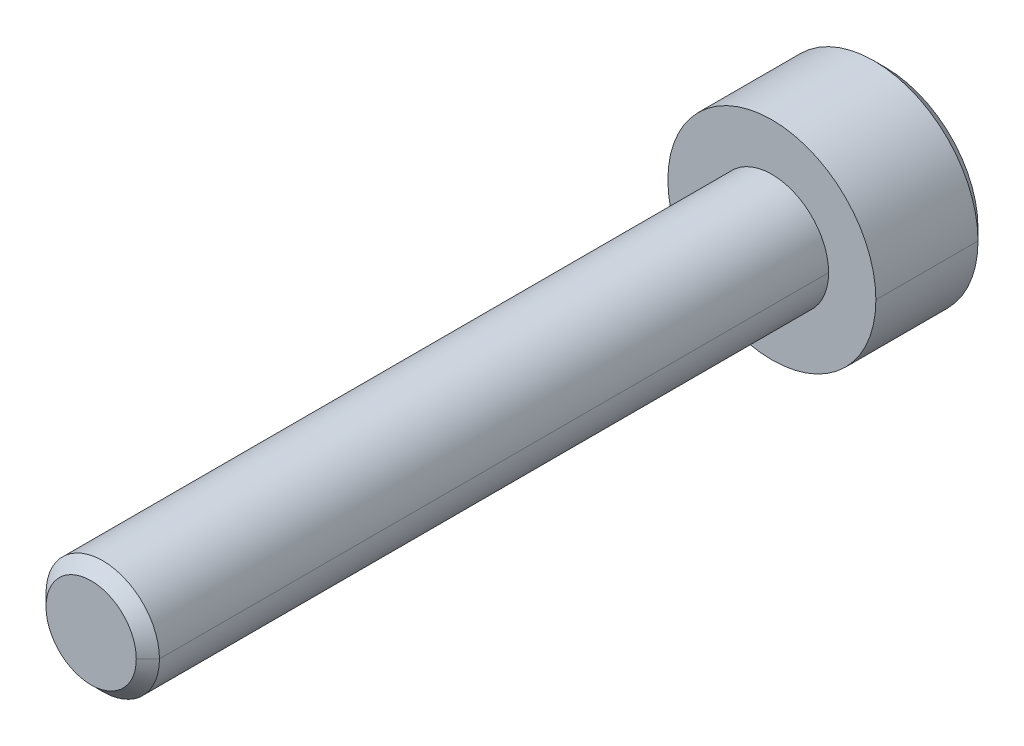
ISO-10303-21;
HEADER;
FILE_DESCRIPTION(('STEP AP214'),'2;1');
FILE_NAME('part.step','',(''),(''),'','','');
FILE_SCHEMA(('AUTOMOTIVE_DESIGN { 1 0 10303 214 1 1 1 1 }'));
ENDSEC;
DATA;
#1=APPLICATION_CONTEXT('core data for automotive mechanical design processes');
#2=APPLICATION_PROTOCOL_DEFINITION('international standard','automotive_design',2000,#1);
#3=PRODUCT_CONTEXT('',#1,'mechanical');
#4=PRODUCT('Part','Part','',(#3));
#5=PRODUCT_RELATED_PRODUCT_CATEGORY('part','',(#4));
#6=PRODUCT_DEFINITION_FORMATION('','',#4);
#7=PRODUCT_DEFINITION_CONTEXT('part definition',#1,'design');
#8=PRODUCT_DEFINITION('design','',#6,#7);
#9=PRODUCT_DEFINITION_SHAPE('','',#8);
#10=(LENGTH_UNIT() NAMED_UNIT(*) SI_UNIT(.MILLI.,.METRE.));
#11=(NAMED_UNIT(*) PLANE_ANGLE_UNIT() SI_UNIT($,.RADIAN.));
#12=(NAMED_UNIT(*) SI_UNIT($,.STERADIAN.) SOLID_ANGLE_UNIT());
#13=UNCERTAINTY_MEASURE_WITH_UNIT(LENGTH_MEASURE(1.E-05),#10,'distance_accuracy_value','');
#14=(GEOMETRIC_REPRESENTATION_CONTEXT(3) GLOBAL_UNCERTAINTY_ASSIGNED_CONTEXT((#13)) GLOBAL_UNIT_ASSIGNED_CONTEXT((#10,
#11,#12)) REPRESENTATION_CONTEXT('',''));
#15=CARTESIAN_POINT('',(0.,0.,0.));
#16=DIRECTION('',(0.,0.,1.));
#17=DIRECTION('',(1.,0.,0.));
#18=AXIS2_PLACEMENT_3D('',#15,#16,#17);
#19=CARTESIAN_POINT('',(0.,0.,1.3));
#20=DIRECTION('',(0.,0.,-1.));
#21=DIRECTION('',(0.,-1.,0.));
#22=AXIS2_PLACEMENT_3D('',#19,#20,#21);
#23=PLANE('',#22);
#24=DIRECTION('',(0.866025403784439,0.5,0.));
#25=VECTOR('',#24,1.);
#26=CARTESIAN_POINT('',(-1.25,0.721687836487033,1.3));
#27=LINE('',#26,#25);
#28=CARTESIAN_POINT('',(-1.25,0.721687836487033,1.3));
#29=VERTEX_POINT('',#28);
#30=CARTESIAN_POINT('',(0.,1.44337567297406,1.3));
#31=VERTEX_POINT('',#30);
#32=EDGE_CURVE('E143',#29,#31,#27,.T.);
#33=ORIENTED_EDGE('',*,*,#32,.T.);
#34=DIRECTION('',(0.866025403784439,-0.5,0.));
#35=VECTOR('',#34,1.);
#36=CARTESIAN_POINT('',(0.,1.44337567297406,1.3));
#37=LINE('',#36,#35);
#38=CARTESIAN_POINT('',(1.25,0.721687836487033,1.3));
#39=VERTEX_POINT('',#38);
#40=EDGE_CURVE('E9',#31,#39,#37,.T.);
#41=ORIENTED_EDGE('',*,*,#40,.T.);
#42=DIRECTION('',(0.,-1.,0.));
#43=VECTOR('',#42,1.);
#44=CARTESIAN_POINT('',(1.25,0.721687836487033,1.3));
#45=LINE('',#44,#43);
#46=CARTESIAN_POINT('',(1.25,-0.721687836487033,1.3));
#47=VERTEX_POINT('',#46);
#48=EDGE_CURVE('E43',#39,#47,#45,.T.);
#49=ORIENTED_EDGE('',*,*,#48,.T.);
#50=DIRECTION('',(-0.866025403784439,-0.5,0.));
#51=VECTOR('',#50,1.);
#52=CARTESIAN_POINT('',(1.25,-0.721687836487033,1.3));
#53=LINE('',#52,#51);
#54=CARTESIAN_POINT('',(0.,-1.44337567297406,1.3));
#55=VERTEX_POINT('',#54);
#56=EDGE_CURVE('E173',#47,#55,#53,.T.);
#57=ORIENTED_EDGE('',*,*,#56,.T.);
#58=DIRECTION('',(-0.866025403784439,0.5,0.));
#59=VECTOR('',#58,1.);
#60=CARTESIAN_POINT('',(0.,-1.44337567297406,1.3));
#61=LINE('',#60,#59);
#62=CARTESIAN_POINT('',(-1.25,-0.721687836487033,1.3));
#63=VERTEX_POINT('',#62);
#64=EDGE_CURVE('E202',#55,#63,#61,.T.);
#65=ORIENTED_EDGE('',*,*,#64,.T.);
#66=DIRECTION('',(0.,1.,0.));
#67=VECTOR('',#66,1.);
#68=CARTESIAN_POINT('',(-1.25,-0.721687836487033,1.3));
#69=LINE('',#68,#67);
#70=EDGE_CURVE('E196',#63,#29,#69,.T.);
#71=ORIENTED_EDGE('',*,*,#70,.T.);
#72=EDGE_LOOP('',(#33,#41,#49,#57,#65,#71));
#73=FACE_BOUND('',#72,.T.);
#74=ADVANCED_FACE('F15',(#73),#23,.T.);
#75=CARTESIAN_POINT('',(0.,1.44337567297406,1.3));
#76=DIRECTION('',(0.5,0.866025403784439,0.));
#77=DIRECTION('',(0.,0.,-1.));
#78=AXIS2_PLACEMENT_3D('',#75,#76,#77);
#79=PLANE('',#78);
#80=DIRECTION('',(0.866025403784439,-0.5,0.));
#81=VECTOR('',#80,1.);
#82=CARTESIAN_POINT('',(0.,1.44337567297406,0.));
#83=LINE('',#82,#81);
#84=CARTESIAN_POINT('',(0.,1.44337567297406,0.));
#85=VERTEX_POINT('',#84);
#86=CARTESIAN_POINT('',(1.25,0.721687836487033,0.));
#87=VERTEX_POINT('',#86);
#88=EDGE_CURVE('E139',#85,#87,#83,.T.);
#89=ORIENTED_EDGE('',*,*,#88,.T.);
#90=DIRECTION('',(0.,0.,-1.));
#91=VECTOR('',#90,1.);
#92=CARTESIAN_POINT('',(1.25,0.721687836487033,1.3));
#93=LINE('',#92,#91);
#94=EDGE_CURVE('E18',#39,#87,#93,.T.);
#95=ORIENTED_EDGE('',*,*,#94,.F.);
#96=ORIENTED_EDGE('',*,*,#40,.F.);
#97=DIRECTION('',(0.,0.,-1.));
#98=VECTOR('',#97,1.);
#99=CARTESIAN_POINT('',(0.,1.44337567297406,1.3));
#100=LINE('',#99,#98);
#101=EDGE_CURVE('E135',#31,#85,#100,.T.);
#102=ORIENTED_EDGE('',*,*,#101,.T.);
#103=EDGE_LOOP('',(#89,#95,#96,#102));
#104=FACE_BOUND('',#103,.T.);
#105=ADVANCED_FACE('F137',(#104),#79,.F.);
#106=CARTESIAN_POINT('',(1.25,0.721687836487033,1.3));
#107=DIRECTION('',(1.,0.,0.));
#108=DIRECTION('',(0.,1.,0.));
#109=AXIS2_PLACEMENT_3D('',#106,#107,#108);
#110=PLANE('',#109);
#111=DIRECTION('',(0.,-1.,0.));
#112=VECTOR('',#111,1.);
#113=CARTESIAN_POINT('',(1.25,0.721687836487033,0.));
#114=LINE('',#113,#112);
#115=CARTESIAN_POINT('',(1.25,-0.721687836487033,0.));
#116=VERTEX_POINT('',#115);
#117=EDGE_CURVE('E162',#87,#116,#114,.T.);
#118=ORIENTED_EDGE('',*,*,#117,.T.);
#119=DIRECTION('',(0.,0.,-1.));
#120=VECTOR('',#119,1.);
#121=CARTESIAN_POINT('',(1.25,-0.721687836487033,1.3));
#122=LINE('',#121,#120);
#123=EDGE_CURVE('E208',#47,#116,#122,.T.);
#124=ORIENTED_EDGE('',*,*,#123,.F.);
#125=ORIENTED_EDGE('',*,*,#48,.F.);
#126=ORIENTED_EDGE('',*,*,#94,.T.);
#127=EDGE_LOOP('',(#118,#124,#125,#126));
#128=FACE_BOUND('',#127,.T.);
#129=ADVANCED_FACE('F217',(#128),#110,.F.);
#130=CARTESIAN_POINT('',(1.25,-0.721687836487033,1.3));
#131=DIRECTION('',(0.5,-0.866025403784439,0.));
#132=DIRECTION('',(0.,0.,-1.));
#133=AXIS2_PLACEMENT_3D('',#130,#131,#132);
#134=PLANE('',#133);
#135=DIRECTION('',(-0.866025403784439,-0.5,0.));
#136=VECTOR('',#135,1.);
#137=CARTESIAN_POINT('',(1.25,-0.721687836487033,0.));
#138=LINE('',#137,#136);
#139=CARTESIAN_POINT('',(0.,-1.44337567297406,0.));
#140=VERTEX_POINT('',#139);
#141=EDGE_CURVE('E181',#116,#140,#138,.T.);
#142=ORIENTED_EDGE('',*,*,#141,.T.);
#143=DIRECTION('',(0.,0.,-1.));
#144=VECTOR('',#143,1.);
#145=CARTESIAN_POINT('',(0.,-1.44337567297406,1.3));
#146=LINE('',#145,#144);
#147=EDGE_CURVE('E205',#55,#140,#146,.T.);
#148=ORIENTED_EDGE('',*,*,#147,.F.);
#149=ORIENTED_EDGE('',*,*,#56,.F.);
#150=ORIENTED_EDGE('',*,*,#123,.T.);
#151=EDGE_LOOP('',(#142,#148,#149,#150));
#152=FACE_BOUND('',#151,.T.);
#153=ADVANCED_FACE('F221',(#152),#134,.F.);
#154=CARTESIAN_POINT('',(0.,-1.44337567297406,1.3));
#155=DIRECTION('',(-0.5,-0.866025403784439,0.));
#156=DIRECTION('',(-0.866025403784439,0.5,0.));
#157=AXIS2_PLACEMENT_3D('',#154,#155,#156);
#158=PLANE('',#157);
#159=DIRECTION('',(-0.866025403784439,0.5,0.));
#160=VECTOR('',#159,1.);
#161=CARTESIAN_POINT('',(0.,-1.44337567297406,0.));
#162=LINE('',#161,#160);
#163=CARTESIAN_POINT('',(-1.25,-0.721687836487033,0.));
#164=VERTEX_POINT('',#163);
#165=EDGE_CURVE('E177',#140,#164,#162,.T.);
#166=ORIENTED_EDGE('',*,*,#165,.T.);
#167=DIRECTION('',(0.,0.,-1.));
#168=VECTOR('',#167,1.);
#169=CARTESIAN_POINT('',(-1.25,-0.721687836487033,1.3));
#170=LINE('',#169,#168);
#171=EDGE_CURVE('E199',#63,#164,#170,.T.);
#172=ORIENTED_EDGE('',*,*,#171,.F.);
#173=ORIENTED_EDGE('',*,*,#64,.F.);
#174=ORIENTED_EDGE('',*,*,#147,.T.);
#175=EDGE_LOOP('',(#166,#172,#173,#174));
#176=FACE_BOUND('',#175,.T.);
#177=ADVANCED_FACE('F496',(#176),#158,.F.);
#178=CARTESIAN_POINT('',(-1.25,-0.721687836487033,1.3));
#179=DIRECTION('',(-1.,0.,0.));
#180=DIRECTION('',(0.,0.,1.));
#181=AXIS2_PLACEMENT_3D('',#178,#179,#180);
#182=PLANE('',#181);
#183=DIRECTION('',(0.,1.,0.));
#184=VECTOR('',#183,1.);
#185=CARTESIAN_POINT('',(-1.25,-0.721687836487033,0.));
#186=LINE('',#185,#184);
#187=CARTESIAN_POINT('',(-1.25,0.721687836487033,0.));
#188=VERTEX_POINT('',#187);
#189=EDGE_CURVE('E155',#164,#188,#186,.T.);
#190=ORIENTED_EDGE('',*,*,#189,.T.);
#191=DIRECTION('',(0.,0.,-1.));
#192=VECTOR('',#191,1.);
#193=CARTESIAN_POINT('',(-1.25,0.721687836487033,1.3));
#194=LINE('',#193,#192);
#195=EDGE_CURVE('E150',#29,#188,#194,.T.);
#196=ORIENTED_EDGE('',*,*,#195,.F.);
#197=ORIENTED_EDGE('',*,*,#70,.F.);
#198=ORIENTED_EDGE('',*,*,#171,.T.);
#199=EDGE_LOOP('',(#190,#196,#197,#198));
#200=FACE_BOUND('',#199,.T.);
#201=ADVANCED_FACE('F493',(#200),#182,.F.);
#202=CARTESIAN_POINT('',(-1.25,0.721687836487033,1.3));
#203=DIRECTION('',(-0.5,0.866025403784439,0.));
#204=DIRECTION('',(0.,0.,1.));
#205=AXIS2_PLACEMENT_3D('',#202,#203,#204);
#206=PLANE('',#205);
#207=DIRECTION('',(0.866025403784439,0.5,0.));
#208=VECTOR('',#207,1.);
#209=CARTESIAN_POINT('',(-1.25,0.721687836487033,0.));
#210=LINE('',#209,#208);
#211=EDGE_CURVE('E147',#188,#85,#210,.T.);
#212=ORIENTED_EDGE('',*,*,#211,.T.);
#213=ORIENTED_EDGE('',*,*,#101,.F.);
#214=ORIENTED_EDGE('',*,*,#32,.F.);
#215=ORIENTED_EDGE('',*,*,#195,.T.);
#216=EDGE_LOOP('',(#212,#213,#214,#215));
#217=FACE_BOUND('',#216,.T.);
#218=ADVANCED_FACE('F148',(#217),#206,.F.);
#219=CARTESIAN_POINT('',(0.,0.,21.));
#220=DIRECTION('',(0.,0.,-1.));
#221=DIRECTION('',(-1.,0.,0.));
#222=AXIS2_PLACEMENT_3D('',#219,#220,#221);
#223=CONICAL_SURFACE('',#222,1.1935,0.785398163397446);
#224=DIRECTION('',(0.707106781186546,0.,-0.707106781186549));
#225=VECTOR('',#224,1.);
#226=CARTESIAN_POINT('',(1.1935,0.,21.));
#227=LINE('',#226,#225);
#228=CARTESIAN_POINT('',(1.1935,0.,21.));
#229=VERTEX_POINT('',#228);
#230=CARTESIAN_POINT('',(1.5,0.,20.6935));
#231=VERTEX_POINT('',#230);
#232=EDGE_CURVE('E403',#229,#231,#227,.T.);
#233=ORIENTED_EDGE('',*,*,#232,.F.);
#234=CARTESIAN_POINT('',(0.,0.,21.));
#235=DIRECTION('',(0.,0.,1.));
#236=DIRECTION('',(1.,0.,0.));
#237=AXIS2_PLACEMENT_3D('',#234,#235,#236);
#238=CIRCLE('',#237,1.1935);
#239=CARTESIAN_POINT('',(-1.1935,0.,21.));
#240=VERTEX_POINT('',#239);
#241=EDGE_CURVE('E144',#240,#229,#238,.T.);
#242=ORIENTED_EDGE('',*,*,#241,.F.);
#243=DIRECTION('',(-0.707106781186546,0.,-0.707106781186549));
#244=VECTOR('',#243,1.);
#245=CARTESIAN_POINT('',(-1.1935,0.,21.));
#246=LINE('',#245,#244);
#247=CARTESIAN_POINT('',(-1.5,0.,20.6935));
#248=VERTEX_POINT('',#247);
#249=EDGE_CURVE('E391',#240,#248,#246,.T.);
#250=ORIENTED_EDGE('',*,*,#249,.T.);
#251=CARTESIAN_POINT('',(0.,0.,20.6935));
#252=DIRECTION('',(0.,0.,-1.));
#253=DIRECTION('',(1.,0.,0.));
#254=AXIS2_PLACEMENT_3D('',#251,#252,#253);
#255=CIRCLE('',#254,1.5);
#256=EDGE_CURVE('E187',#231,#248,#255,.T.);
#257=ORIENTED_EDGE('',*,*,#256,.F.);
#258=EDGE_LOOP('',(#233,#242,#250,#257));
#259=FACE_BOUND('',#258,.T.);
#260=ADVANCED_FACE('F508',(#259),#223,.T.);
#261=CARTESIAN_POINT('',(0.,0.,0.299999999999996));
#262=DIRECTION('',(0.,0.,1.));
#263=DIRECTION('',(1.,0.,0.));
#264=AXIS2_PLACEMENT_3D('',#261,#262,#263);
#265=CONICAL_SURFACE('',#264,2.75,0.78539816339745);
#266=DIRECTION('',(-0.707106781186549,0.,0.707106781186546));
#267=VECTOR('',#266,1.);
#268=CARTESIAN_POINT('',(-2.75,0.,0.299999999999996));
#269=LINE('',#268,#267);
#270=CARTESIAN_POINT('',(-2.45,0.,0.));
#271=VERTEX_POINT('',#270);
#272=CARTESIAN_POINT('',(-2.75,0.,0.299999999999996));
#273=VERTEX_POINT('',#272);
#274=EDGE_CURVE('E364',#271,#273,#269,.T.);
#275=ORIENTED_EDGE('',*,*,#274,.F.);
#276=CARTESIAN_POINT('',(0.,0.,0.));
#277=DIRECTION('',(0.,0.,-1.));
#278=DIRECTION('',(1.,0.,0.));
#279=AXIS2_PLACEMENT_3D('',#276,#277,#278);
#280=CIRCLE('',#279,2.45);
#281=CARTESIAN_POINT('',(2.45,0.,0.));
#282=VERTEX_POINT('',#281);
#283=EDGE_CURVE('E164',#282,#271,#280,.T.);
#284=ORIENTED_EDGE('',*,*,#283,.F.);
#285=DIRECTION('',(0.707106781186549,0.,0.707106781186546));
#286=VECTOR('',#285,1.);
#287=CARTESIAN_POINT('',(2.75,0.,0.299999999999996));
#288=LINE('',#287,#286);
#289=CARTESIAN_POINT('',(2.75,0.,0.299999999999996));
#290=VERTEX_POINT('',#289);
#291=EDGE_CURVE('E341',#282,#290,#288,.T.);
#292=ORIENTED_EDGE('',*,*,#291,.T.);
#293=CARTESIAN_POINT('',(0.,0.,0.299999999999996));
#294=DIRECTION('',(0.,0.,1.));
#295=DIRECTION('',(1.,0.,0.));
#296=AXIS2_PLACEMENT_3D('',#293,#294,#295);
#297=CIRCLE('',#296,2.75);
#298=EDGE_CURVE('E306',#273,#290,#297,.T.);
#299=ORIENTED_EDGE('',*,*,#298,.F.);
#300=EDGE_LOOP('',(#275,#284,#292,#299));
#301=FACE_BOUND('',#300,.T.);
#302=ADVANCED_FACE('F466',(#301),#265,.T.);
#303=CARTESIAN_POINT('',(0.,0.,21.));
#304=DIRECTION('',(0.,0.,1.));
#305=DIRECTION('',(1.,0.,0.));
#306=AXIS2_PLACEMENT_3D('',#303,#304,#305);
#307=PLANE('',#306);
#308=ORIENTED_EDGE('',*,*,#241,.T.);
#309=CARTESIAN_POINT('',(0.,0.,21.));
#310=DIRECTION('',(0.,0.,1.));
#311=DIRECTION('',(1.,0.,0.));
#312=AXIS2_PLACEMENT_3D('',#309,#310,#311);
#313=CIRCLE('',#312,1.1935);
#314=EDGE_CURVE('E408',#229,#240,#313,.T.);
#315=ORIENTED_EDGE('',*,*,#314,.T.);
#316=EDGE_LOOP('',(#308,#315));
#317=FACE_BOUND('',#316,.T.);
#318=ADVANCED_FACE('F481',(#317),#307,.T.);
#319=CARTESIAN_POINT('',(0.,0.,21.));
#320=DIRECTION('',(0.,0.,-1.));
#321=DIRECTION('',(-1.,0.,0.));
#322=AXIS2_PLACEMENT_3D('',#319,#320,#321);
#323=CYLINDRICAL_SURFACE('',#322,1.5);
#324=DIRECTION('',(0.,0.,-1.));
#325=VECTOR('',#324,1.);
#326=CARTESIAN_POINT('',(1.5,0.,21.));
#327=LINE('',#326,#325);
#328=CARTESIAN_POINT('',(1.5,0.,3.));
#329=VERTEX_POINT('',#328);
#330=EDGE_CURVE('E325',#231,#329,#327,.T.);
#331=ORIENTED_EDGE('',*,*,#330,.F.);
#332=ORIENTED_EDGE('',*,*,#256,.T.);
#333=DIRECTION('',(0.,0.,-1.));
#334=VECTOR('',#333,1.);
#335=CARTESIAN_POINT('',(-1.5,0.,21.));
#336=LINE('',#335,#334);
#337=CARTESIAN_POINT('',(-1.5,0.,3.));
#338=VERTEX_POINT('',#337);
#339=EDGE_CURVE('E316',#248,#338,#336,.T.);
#340=ORIENTED_EDGE('',*,*,#339,.T.);
#341=CARTESIAN_POINT('',(0.,0.,3.));
#342=DIRECTION('',(0.,0.,1.));
#343=DIRECTION('',(1.,0.,0.));
#344=AXIS2_PLACEMENT_3D('',#341,#342,#343);
#345=CIRCLE('',#344,1.5);
#346=EDGE_CURVE('E170',#338,#329,#345,.T.);
#347=ORIENTED_EDGE('',*,*,#346,.T.);
#348=EDGE_LOOP('',(#331,#332,#340,#347));
#349=FACE_BOUND('',#348,.T.);
#350=ADVANCED_FACE('F472',(#349),#323,.T.);
#351=CARTESIAN_POINT('',(0.,0.,0.));
#352=DIRECTION('',(0.,0.,1.));
#353=DIRECTION('',(1.,0.,0.));
#354=AXIS2_PLACEMENT_3D('',#351,#352,#353);
#355=PLANE('',#354);
#356=ORIENTED_EDGE('',*,*,#88,.F.);
#357=ORIENTED_EDGE('',*,*,#211,.F.);
#358=ORIENTED_EDGE('',*,*,#189,.F.);
#359=ORIENTED_EDGE('',*,*,#165,.F.);
#360=ORIENTED_EDGE('',*,*,#141,.F.);
#361=ORIENTED_EDGE('',*,*,#117,.F.);
#362=EDGE_LOOP('',(#356,#357,#358,#359,#360,#361));
#363=FACE_BOUND('',#362,.T.);
#364=ORIENTED_EDGE('',*,*,#283,.T.);
#365=CARTESIAN_POINT('',(0.,0.,0.));
#366=DIRECTION('',(0.,0.,-1.));
#367=DIRECTION('',(1.,0.,0.));
#368=AXIS2_PLACEMENT_3D('',#365,#366,#367);
#369=CIRCLE('',#368,2.45);
#370=EDGE_CURVE('E383',#271,#282,#369,.T.);
#371=ORIENTED_EDGE('',*,*,#370,.T.);
#372=EDGE_LOOP('',(#364,#371));
#373=FACE_BOUND('',#372,.T.);
#374=ADVANCED_FACE('F158',(#363,#373),#355,.F.);
#375=CARTESIAN_POINT('',(0.,0.,3.));
#376=DIRECTION('',(0.,0.,1.));
#377=DIRECTION('',(1.,0.,0.));
#378=AXIS2_PLACEMENT_3D('',#375,#376,#377);
#379=PLANE('',#378);
#380=ORIENTED_EDGE('',*,*,#346,.F.);
#381=CARTESIAN_POINT('',(0.,0.,3.));
#382=DIRECTION('',(0.,0.,1.));
#383=DIRECTION('',(1.,0.,0.));
#384=AXIS2_PLACEMENT_3D('',#381,#382,#383);
#385=CIRCLE('',#384,1.5);
#386=EDGE_CURVE('E320',#329,#338,#385,.T.);
#387=ORIENTED_EDGE('',*,*,#386,.F.);
#388=EDGE_LOOP('',(#380,#387));
#389=FACE_BOUND('',#388,.T.);
#390=CARTESIAN_POINT('',(0.,0.,3.));
#391=DIRECTION('',(0.,0.,1.));
#392=DIRECTION('',(1.,0.,0.));
#393=AXIS2_PLACEMENT_3D('',#390,#391,#392);
#394=CIRCLE('',#393,2.75);
#395=CARTESIAN_POINT('',(-2.75,0.,3.));
#396=VERTEX_POINT('',#395);
#397=CARTESIAN_POINT('',(2.75,0.,3.));
#398=VERTEX_POINT('',#397);
#399=EDGE_CURVE('E353',#396,#398,#394,.T.);
#400=ORIENTED_EDGE('',*,*,#399,.T.);
#401=CARTESIAN_POINT('',(0.,0.,3.));
#402=DIRECTION('',(0.,0.,1.));
#403=DIRECTION('',(1.,0.,0.));
#404=AXIS2_PLACEMENT_3D('',#401,#402,#403);
#405=CIRCLE('',#404,2.75);
#406=EDGE_CURVE('E310',#398,#396,#405,.T.);
#407=ORIENTED_EDGE('',*,*,#406,.T.);
#408=EDGE_LOOP('',(#400,#407));
#409=FACE_BOUND('',#408,.T.);
#410=ADVANCED_FACE('F471',(#389,#409),#379,.T.);
#411=CARTESIAN_POINT('',(0.,0.,3.));
#412=DIRECTION('',(0.,0.,-1.));
#413=DIRECTION('',(-1.,0.,0.));
#414=AXIS2_PLACEMENT_3D('',#411,#412,#413);
#415=CYLINDRICAL_SURFACE('',#414,2.75);
#416=DIRECTION('',(0.,0.,-1.));
#417=VECTOR('',#416,1.);
#418=CARTESIAN_POINT('',(2.75,0.,3.));
#419=LINE('',#418,#417);
#420=EDGE_CURVE('E315',#398,#290,#419,.T.);
#421=ORIENTED_EDGE('',*,*,#420,.F.);
#422=ORIENTED_EDGE('',*,*,#399,.F.);
#423=DIRECTION('',(0.,0.,-1.));
#424=VECTOR('',#423,1.);
#425=CARTESIAN_POINT('',(-2.75,0.,3.));
#426=LINE('',#425,#424);
#427=EDGE_CURVE('E333',#396,#273,#426,.T.);
#428=ORIENTED_EDGE('',*,*,#427,.T.);
#429=ORIENTED_EDGE('',*,*,#298,.T.);
#430=EDGE_LOOP('',(#421,#422,#428,#429));
#431=FACE_BOUND('',#430,.T.);
#432=ADVANCED_FACE('F457',(#431),#415,.T.);
#433=CARTESIAN_POINT('',(0.,0.,3.));
#434=DIRECTION('',(0.,0.,-1.));
#435=DIRECTION('',(-1.,0.,0.));
#436=AXIS2_PLACEMENT_3D('',#433,#434,#435);
#437=CYLINDRICAL_SURFACE('',#436,2.75);
#438=ORIENTED_EDGE('',*,*,#406,.F.);
#439=ORIENTED_EDGE('',*,*,#420,.T.);
#440=CARTESIAN_POINT('',(0.,0.,0.299999999999996));
#441=DIRECTION('',(0.,0.,1.));
#442=DIRECTION('',(1.,0.,0.));
#443=AXIS2_PLACEMENT_3D('',#440,#441,#442);
#444=CIRCLE('',#443,2.75);
#445=EDGE_CURVE('E349',#290,#273,#444,.T.);
#446=ORIENTED_EDGE('',*,*,#445,.T.);
#447=ORIENTED_EDGE('',*,*,#427,.F.);
#448=EDGE_LOOP('',(#438,#439,#446,#447));
#449=FACE_BOUND('',#448,.T.);
#450=ADVANCED_FACE('F463',(#449),#437,.T.);
#451=CARTESIAN_POINT('',(0.,0.,21.));
#452=DIRECTION('',(0.,0.,-1.));
#453=DIRECTION('',(-1.,0.,0.));
#454=AXIS2_PLACEMENT_3D('',#451,#452,#453);
#455=CYLINDRICAL_SURFACE('',#454,1.5);
#456=CARTESIAN_POINT('',(0.,0.,20.6935));
#457=DIRECTION('',(0.,0.,-1.));
#458=DIRECTION('',(1.,0.,0.));
#459=AXIS2_PLACEMENT_3D('',#456,#457,#458);
#460=CIRCLE('',#459,1.5);
#461=EDGE_CURVE('E399',#248,#231,#460,.T.);
#462=ORIENTED_EDGE('',*,*,#461,.T.);
#463=ORIENTED_EDGE('',*,*,#330,.T.);
#464=ORIENTED_EDGE('',*,*,#386,.T.);
#465=ORIENTED_EDGE('',*,*,#339,.F.);
#466=EDGE_LOOP('',(#462,#463,#464,#465));
#467=FACE_BOUND('',#466,.T.);
#468=ADVANCED_FACE('F567',(#467),#455,.T.);
#469=CARTESIAN_POINT('',(0.,0.,0.299999999999996));
#470=DIRECTION('',(0.,0.,1.));
#471=DIRECTION('',(1.,0.,0.));
#472=AXIS2_PLACEMENT_3D('',#469,#470,#471);
#473=CONICAL_SURFACE('',#472,2.75,0.78539816339745);
#474=ORIENTED_EDGE('',*,*,#370,.F.);
#475=ORIENTED_EDGE('',*,*,#274,.T.);
#476=ORIENTED_EDGE('',*,*,#445,.F.);
#477=ORIENTED_EDGE('',*,*,#291,.F.);
#478=EDGE_LOOP('',(#474,#475,#476,#477));
#479=FACE_BOUND('',#478,.T.);
#480=ADVANCED_FACE('F469',(#479),#473,.T.);
#481=CARTESIAN_POINT('',(0.,0.,21.));
#482=DIRECTION('',(0.,0.,-1.));
#483=DIRECTION('',(-1.,0.,0.));
#484=AXIS2_PLACEMENT_3D('',#481,#482,#483);
#485=CONICAL_SURFACE('',#484,1.1935,0.785398163397446);
#486=ORIENTED_EDGE('',*,*,#314,.F.);
#487=ORIENTED_EDGE('',*,*,#232,.T.);
#488=ORIENTED_EDGE('',*,*,#461,.F.);
#489=ORIENTED_EDGE('',*,*,#249,.F.);
#490=EDGE_LOOP('',(#486,#487,#488,#489));
#491=FACE_BOUND('',#490,.T.);
#492=ADVANCED_FACE('F586',(#491),#485,.T.);
#493=CLOSED_SHELL('',(#74,#105,#129,#153,#177,#201,#218,#260,#302,#318,#350,#374,#410,#432,#450,
#468,#480,#492));
#494=MANIFOLD_SOLID_BREP('B1',#493);
#495=ADVANCED_BREP_SHAPE_REPRESENTATION('',(#18,#494),#14);
#496=SHAPE_DEFINITION_REPRESENTATION(#9,#495);
ENDSEC;
END-ISO-10303-21;
